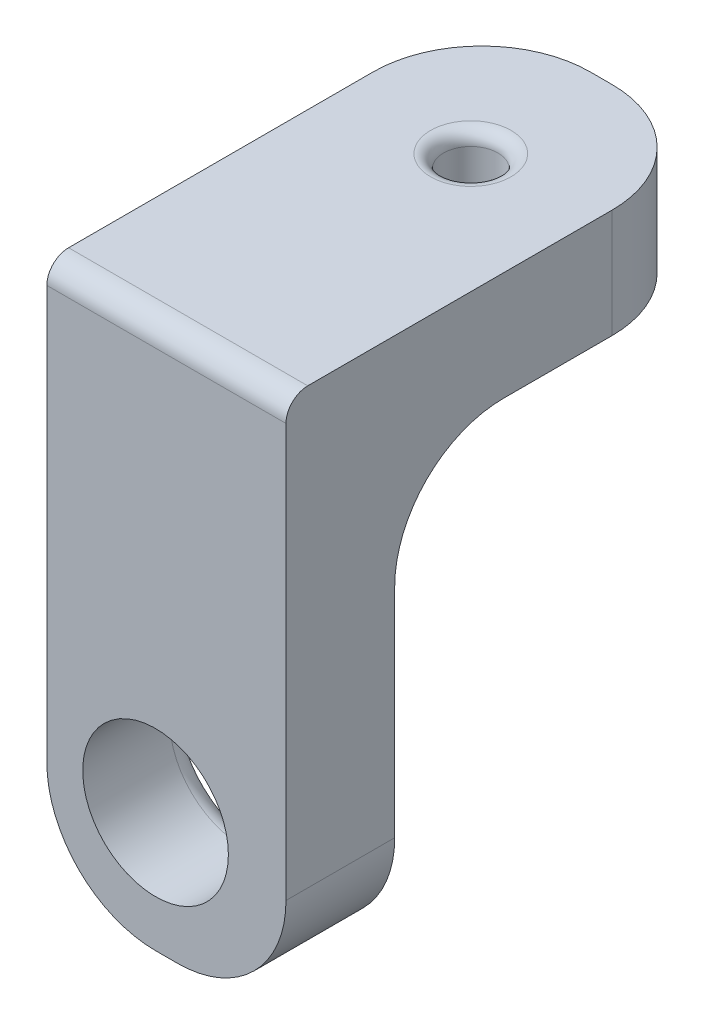
ISO-10303-21;
HEADER;
FILE_DESCRIPTION(('STEP AP214'),'2;1');
FILE_NAME('part.step','',(''),(''),'','','');
FILE_SCHEMA(('AUTOMOTIVE_DESIGN { 1 0 10303 214 1 1 1 1 }'));
ENDSEC;
DATA;
#1=APPLICATION_CONTEXT('core data for automotive mechanical design processes');
#2=APPLICATION_PROTOCOL_DEFINITION('international standard','automotive_design',2000,#1);
#3=PRODUCT_CONTEXT('',#1,'mechanical');
#4=PRODUCT('Part','Part','',(#3));
#5=PRODUCT_RELATED_PRODUCT_CATEGORY('part','',(#4));
#6=PRODUCT_DEFINITION_FORMATION('','',#4);
#7=PRODUCT_DEFINITION_CONTEXT('part definition',#1,'design');
#8=PRODUCT_DEFINITION('design','',#6,#7);
#9=PRODUCT_DEFINITION_SHAPE('','',#8);
#10=(LENGTH_UNIT() NAMED_UNIT(*) SI_UNIT(.MILLI.,.METRE.));
#11=(NAMED_UNIT(*) PLANE_ANGLE_UNIT() SI_UNIT($,.RADIAN.));
#12=(NAMED_UNIT(*) SI_UNIT($,.STERADIAN.) SOLID_ANGLE_UNIT());
#13=UNCERTAINTY_MEASURE_WITH_UNIT(LENGTH_MEASURE(1.E-05),#10,'distance_accuracy_value','');
#14=(GEOMETRIC_REPRESENTATION_CONTEXT(3) GLOBAL_UNCERTAINTY_ASSIGNED_CONTEXT((#13)) GLOBAL_UNIT_ASSIGNED_CONTEXT((#10,
#11,#12)) REPRESENTATION_CONTEXT('',''));
#15=CARTESIAN_POINT('',(0.,0.,0.));
#16=DIRECTION('',(0.,0.,1.));
#17=DIRECTION('',(1.,0.,0.));
#18=AXIS2_PLACEMENT_3D('',#15,#16,#17);
#19=CARTESIAN_POINT('',(0.,0.,5.));
#20=DIRECTION('',(0.,0.,1.));
#21=DIRECTION('',(1.,0.,0.));
#22=AXIS2_PLACEMENT_3D('',#19,#20,#21);
#23=PLANE('',#22);
#24=DIRECTION('',(1.,0.,0.));
#25=VECTOR('',#24,1.);
#26=CARTESIAN_POINT('',(-5.,-5.5,5.));
#27=LINE('',#26,#25);
#28=CARTESIAN_POINT('',(0.,-5.5,5.));
#29=VERTEX_POINT('',#28);
#30=CARTESIAN_POINT('',(0.999999999999999,-5.5,5.));
#31=VERTEX_POINT('',#30);
#32=EDGE_CURVE('E272',#29,#31,#27,.T.);
#33=ORIENTED_EDGE('',*,*,#32,.T.);
#34=CARTESIAN_POINT('',(0.999999999999999,-0.5,5.));
#35=DIRECTION('',(0.,0.,1.));
#36=DIRECTION('',(1.,0.,0.));
#37=AXIS2_PLACEMENT_3D('',#34,#35,#36);
#38=CIRCLE('',#37,5.);
#39=CARTESIAN_POINT('',(6.,-0.5,5.));
#40=VERTEX_POINT('',#39);
#41=EDGE_CURVE('E346',#31,#40,#38,.T.);
#42=ORIENTED_EDGE('',*,*,#41,.T.);
#43=DIRECTION('',(0.,1.,0.));
#44=VECTOR('',#43,1.);
#45=CARTESIAN_POINT('',(6.,14.5,5.));
#46=LINE('',#45,#44);
#47=CARTESIAN_POINT('',(6.,18.5,5.));
#48=VERTEX_POINT('',#47);
#49=EDGE_CURVE('E277',#40,#48,#46,.T.);
#50=ORIENTED_EDGE('',*,*,#49,.T.);
#51=DIRECTION('',(1.,0.,0.));
#52=VECTOR('',#51,1.);
#53=CARTESIAN_POINT('',(-5.,18.5,5.));
#54=LINE('',#53,#52);
#55=CARTESIAN_POINT('',(-5.,18.5,5.));
#56=VERTEX_POINT('',#55);
#57=EDGE_CURVE('E319',#48,#56,#54,.F.);
#58=ORIENTED_EDGE('',*,*,#57,.T.);
#59=DIRECTION('',(0.,-1.,0.));
#60=VECTOR('',#59,1.);
#61=CARTESIAN_POINT('',(-5.,14.5,5.));
#62=LINE('',#61,#60);
#63=CARTESIAN_POINT('',(-5.,-0.5,5.));
#64=VERTEX_POINT('',#63);
#65=EDGE_CURVE('E268',#56,#64,#62,.T.);
#66=ORIENTED_EDGE('',*,*,#65,.T.);
#67=CARTESIAN_POINT('',(0.,-0.5,5.));
#68=DIRECTION('',(0.,0.,1.));
#69=DIRECTION('',(1.,0.,0.));
#70=AXIS2_PLACEMENT_3D('',#67,#68,#69);
#71=CIRCLE('',#70,5.);
#72=EDGE_CURVE('E343',#64,#29,#71,.T.);
#73=ORIENTED_EDGE('',*,*,#72,.T.);
#74=EDGE_LOOP('',(#33,#42,#50,#58,#66,#73));
#75=FACE_BOUND('',#74,.T.);
#76=CARTESIAN_POINT('',(0.,0.,5.));
#77=DIRECTION('',(0.,0.,1.));
#78=DIRECTION('',(1.,0.,0.));
#79=AXIS2_PLACEMENT_3D('',#76,#77,#78);
#80=CIRCLE('',#79,3.35);
#81=CARTESIAN_POINT('',(3.35,0.,5.));
#82=VERTEX_POINT('',#81);
#83=EDGE_CURVE('E255',#82,#82,#80,.T.);
#84=ORIENTED_EDGE('',*,*,#83,.F.);
#85=EDGE_LOOP('',(#84));
#86=FACE_BOUND('',#85,.T.);
#87=ADVANCED_FACE('F41',(#75,#86),#23,.T.);
#88=CARTESIAN_POINT('',(0.,0.,0.));
#89=DIRECTION('',(0.,0.,1.));
#90=DIRECTION('',(1.,0.,0.));
#91=AXIS2_PLACEMENT_3D('',#88,#89,#90);
#92=PLANE('',#91);
#93=CARTESIAN_POINT('',(0.,0.,0.));
#94=DIRECTION('',(0.,0.,1.));
#95=DIRECTION('',(1.,0.,0.));
#96=AXIS2_PLACEMENT_3D('',#93,#94,#95);
#97=CIRCLE('',#96,4.35);
#98=CARTESIAN_POINT('',(4.35,0.,0.));
#99=VERTEX_POINT('',#98);
#100=EDGE_CURVE('E303',#99,#99,#97,.T.);
#101=ORIENTED_EDGE('',*,*,#100,.T.);
#102=EDGE_LOOP('',(#101));
#103=FACE_BOUND('',#102,.T.);
#104=DIRECTION('',(0.,1.,0.));
#105=VECTOR('',#104,1.);
#106=CARTESIAN_POINT('',(6.,14.5,0.));
#107=LINE('',#106,#105);
#108=CARTESIAN_POINT('',(6.,-0.5,0.));
#109=VERTEX_POINT('',#108);
#110=CARTESIAN_POINT('',(6.,9.5,0.));
#111=VERTEX_POINT('',#110);
#112=EDGE_CURVE('E273',#109,#111,#107,.T.);
#113=ORIENTED_EDGE('',*,*,#112,.F.);
#114=CARTESIAN_POINT('',(0.999999999999999,-0.5,0.));
#115=DIRECTION('',(0.,0.,1.));
#116=DIRECTION('',(1.,0.,0.));
#117=AXIS2_PLACEMENT_3D('',#114,#115,#116);
#118=CIRCLE('',#117,5.);
#119=CARTESIAN_POINT('',(0.999999999999999,-5.5,0.));
#120=VERTEX_POINT('',#119);
#121=EDGE_CURVE('E333',#109,#120,#118,.F.);
#122=ORIENTED_EDGE('',*,*,#121,.T.);
#123=DIRECTION('',(1.,0.,0.));
#124=VECTOR('',#123,1.);
#125=CARTESIAN_POINT('',(-5.,-5.5,0.));
#126=LINE('',#125,#124);
#127=CARTESIAN_POINT('',(0.,-5.5,0.));
#128=VERTEX_POINT('',#127);
#129=EDGE_CURVE('E284',#128,#120,#126,.T.);
#130=ORIENTED_EDGE('',*,*,#129,.F.);
#131=CARTESIAN_POINT('',(0.,-0.5,0.));
#132=DIRECTION('',(0.,0.,1.));
#133=DIRECTION('',(1.,0.,0.));
#134=AXIS2_PLACEMENT_3D('',#131,#132,#133);
#135=CIRCLE('',#134,5.);
#136=CARTESIAN_POINT('',(-5.,-0.5,0.));
#137=VERTEX_POINT('',#136);
#138=EDGE_CURVE('E330',#128,#137,#135,.F.);
#139=ORIENTED_EDGE('',*,*,#138,.T.);
#140=DIRECTION('',(0.,-1.,0.));
#141=VECTOR('',#140,1.);
#142=CARTESIAN_POINT('',(-5.,14.5,0.));
#143=LINE('',#142,#141);
#144=CARTESIAN_POINT('',(-5.,9.5,0.));
#145=VERTEX_POINT('',#144);
#146=EDGE_CURVE('E267',#145,#137,#143,.T.);
#147=ORIENTED_EDGE('',*,*,#146,.F.);
#148=DIRECTION('',(-1.,0.,0.));
#149=VECTOR('',#148,1.);
#150=CARTESIAN_POINT('',(0.,9.5,0.));
#151=LINE('',#150,#149);
#152=EDGE_CURVE('E293',#145,#111,#151,.F.);
#153=ORIENTED_EDGE('',*,*,#152,.T.);
#154=EDGE_LOOP('',(#113,#122,#130,#139,#147,#153));
#155=FACE_BOUND('',#154,.T.);
#156=ADVANCED_FACE('F393',(#103,#155),#92,.F.);
#157=CARTESIAN_POINT('',(-5.,14.5,5.));
#158=DIRECTION('',(1.,0.,0.));
#159=DIRECTION('',(0.,1.,0.));
#160=AXIS2_PLACEMENT_3D('',#157,#158,#159);
#161=PLANE('',#160);
#162=DIRECTION('',(0.,0.,1.));
#163=VECTOR('',#162,1.);
#164=CARTESIAN_POINT('',(-5.,19.5,5.));
#165=LINE('',#164,#163);
#166=CARTESIAN_POINT('',(-5.,19.5,-10.));
#167=VERTEX_POINT('',#166);
#168=CARTESIAN_POINT('',(-5.,19.5,4.));
#169=VERTEX_POINT('',#168);
#170=EDGE_CURVE('E244',#167,#169,#165,.T.);
#171=ORIENTED_EDGE('',*,*,#170,.F.);
#172=DIRECTION('',(0.,-1.,0.));
#173=VECTOR('',#172,1.);
#174=CARTESIAN_POINT('',(-5.,14.5,-10.));
#175=LINE('',#174,#173);
#176=CARTESIAN_POINT('',(-5.,14.5,-10.));
#177=VERTEX_POINT('',#176);
#178=EDGE_CURVE('E352',#167,#177,#175,.T.);
#179=ORIENTED_EDGE('',*,*,#178,.T.);
#180=DIRECTION('',(0.,0.,1.));
#181=VECTOR('',#180,1.);
#182=CARTESIAN_POINT('',(-5.,14.5,5.));
#183=LINE('',#182,#181);
#184=CARTESIAN_POINT('',(-5.,14.5,-5.));
#185=VERTEX_POINT('',#184);
#186=EDGE_CURVE('E232',#177,#185,#183,.T.);
#187=ORIENTED_EDGE('',*,*,#186,.T.);
#188=CARTESIAN_POINT('',(-5.,9.5,-5.));
#189=DIRECTION('',(1.,0.,0.));
#190=DIRECTION('',(0.,1.,0.));
#191=AXIS2_PLACEMENT_3D('',#188,#189,#190);
#192=CIRCLE('',#191,5.);
#193=EDGE_CURVE('E297',#185,#145,#192,.T.);
#194=ORIENTED_EDGE('',*,*,#193,.T.);
#195=ORIENTED_EDGE('',*,*,#146,.T.);
#196=DIRECTION('',(0.,0.,-1.));
#197=VECTOR('',#196,1.);
#198=CARTESIAN_POINT('',(-5.,-0.5,5.));
#199=LINE('',#198,#197);
#200=EDGE_CURVE('E349',#137,#64,#199,.F.);
#201=ORIENTED_EDGE('',*,*,#200,.T.);
#202=ORIENTED_EDGE('',*,*,#65,.F.);
#203=CARTESIAN_POINT('',(-5.,18.5,4.));
#204=DIRECTION('',(1.,0.,0.));
#205=DIRECTION('',(0.,1.,0.));
#206=AXIS2_PLACEMENT_3D('',#203,#204,#205);
#207=CIRCLE('',#206,1.);
#208=EDGE_CURVE('E322',#56,#169,#207,.F.);
#209=ORIENTED_EDGE('',*,*,#208,.T.);
#210=EDGE_LOOP('',(#171,#179,#187,#194,#195,#201,#202,#209));
#211=FACE_BOUND('',#210,.T.);
#212=ADVANCED_FACE('F399',(#211),#161,.F.);
#213=CARTESIAN_POINT('',(-5.,-5.5,5.));
#214=DIRECTION('',(0.,1.,0.));
#215=DIRECTION('',(0.,0.,1.));
#216=AXIS2_PLACEMENT_3D('',#213,#214,#215);
#217=PLANE('',#216);
#218=ORIENTED_EDGE('',*,*,#129,.T.);
#219=DIRECTION('',(0.,0.,-1.));
#220=VECTOR('',#219,1.);
#221=CARTESIAN_POINT('',(0.999999999999999,-5.5,5.));
#222=LINE('',#221,#220);
#223=EDGE_CURVE('E340',#120,#31,#222,.F.);
#224=ORIENTED_EDGE('',*,*,#223,.T.);
#225=ORIENTED_EDGE('',*,*,#32,.F.);
#226=DIRECTION('',(0.,0.,-1.));
#227=VECTOR('',#226,1.);
#228=CARTESIAN_POINT('',(0.,-5.5,5.));
#229=LINE('',#228,#227);
#230=EDGE_CURVE('E336',#29,#128,#229,.T.);
#231=ORIENTED_EDGE('',*,*,#230,.T.);
#232=EDGE_LOOP('',(#218,#224,#225,#231));
#233=FACE_BOUND('',#232,.T.);
#234=ADVANCED_FACE('F410',(#233),#217,.F.);
#235=CARTESIAN_POINT('',(6.,14.5,5.));
#236=DIRECTION('',(-1.,0.,0.));
#237=DIRECTION('',(0.,-1.,0.));
#238=AXIS2_PLACEMENT_3D('',#235,#236,#237);
#239=PLANE('',#238);
#240=DIRECTION('',(0.,0.,-1.));
#241=VECTOR('',#240,1.);
#242=CARTESIAN_POINT('',(6.,14.5,5.));
#243=LINE('',#242,#241);
#244=CARTESIAN_POINT('',(6.,14.5,-5.));
#245=VERTEX_POINT('',#244);
#246=CARTESIAN_POINT('',(6.,14.5,-10.));
#247=VERTEX_POINT('',#246);
#248=EDGE_CURVE('E258',#245,#247,#243,.T.);
#249=ORIENTED_EDGE('',*,*,#248,.T.);
#250=DIRECTION('',(0.,-1.,0.));
#251=VECTOR('',#250,1.);
#252=CARTESIAN_POINT('',(6.,14.5,-10.));
#253=LINE('',#252,#251);
#254=CARTESIAN_POINT('',(6.,19.5,-10.));
#255=VERTEX_POINT('',#254);
#256=EDGE_CURVE('E65',#247,#255,#253,.F.);
#257=ORIENTED_EDGE('',*,*,#256,.T.);
#258=DIRECTION('',(0.,0.,-1.));
#259=VECTOR('',#258,1.);
#260=CARTESIAN_POINT('',(6.,19.5,5.));
#261=LINE('',#260,#259);
#262=CARTESIAN_POINT('',(6.,19.5,4.));
#263=VERTEX_POINT('',#262);
#264=EDGE_CURVE('E247',#263,#255,#261,.T.);
#265=ORIENTED_EDGE('',*,*,#264,.F.);
#266=CARTESIAN_POINT('',(6.,18.5,4.));
#267=DIRECTION('',(-1.,0.,0.));
#268=DIRECTION('',(0.,-1.,0.));
#269=AXIS2_PLACEMENT_3D('',#266,#267,#268);
#270=CIRCLE('',#269,1.);
#271=EDGE_CURVE('E315',#263,#48,#270,.F.);
#272=ORIENTED_EDGE('',*,*,#271,.T.);
#273=ORIENTED_EDGE('',*,*,#49,.F.);
#274=DIRECTION('',(0.,0.,-1.));
#275=VECTOR('',#274,1.);
#276=CARTESIAN_POINT('',(6.,-0.5,5.));
#277=LINE('',#276,#275);
#278=EDGE_CURVE('E326',#40,#109,#277,.T.);
#279=ORIENTED_EDGE('',*,*,#278,.T.);
#280=ORIENTED_EDGE('',*,*,#112,.T.);
#281=CARTESIAN_POINT('',(6.,9.5,-5.));
#282=DIRECTION('',(-1.,0.,0.));
#283=DIRECTION('',(0.,-1.,0.));
#284=AXIS2_PLACEMENT_3D('',#281,#282,#283);
#285=CIRCLE('',#284,5.);
#286=EDGE_CURVE('E300',#111,#245,#285,.T.);
#287=ORIENTED_EDGE('',*,*,#286,.T.);
#288=EDGE_LOOP('',(#249,#257,#265,#272,#273,#279,#280,#287));
#289=FACE_BOUND('',#288,.T.);
#290=ADVANCED_FACE('F407',(#289),#239,.F.);
#291=CARTESIAN_POINT('',(0.,0.,5.));
#292=DIRECTION('',(0.,0.,-1.));
#293=DIRECTION('',(-1.,0.,0.));
#294=AXIS2_PLACEMENT_3D('',#291,#292,#293);
#295=CYLINDRICAL_SURFACE('',#294,3.35);
#296=CARTESIAN_POINT('',(0.,0.,1.));
#297=DIRECTION('',(0.,0.,1.));
#298=DIRECTION('',(1.,0.,0.));
#299=AXIS2_PLACEMENT_3D('',#296,#297,#298);
#300=CIRCLE('',#299,3.35);
#301=CARTESIAN_POINT('',(3.35,0.,1.));
#302=VERTEX_POINT('',#301);
#303=EDGE_CURVE('E307',#302,#302,#300,.F.);
#304=ORIENTED_EDGE('',*,*,#303,.T.);
#305=EDGE_LOOP('',(#304));
#306=FACE_BOUND('',#305,.T.);
#307=ORIENTED_EDGE('',*,*,#83,.T.);
#308=EDGE_LOOP('',(#307));
#309=FACE_BOUND('',#308,.T.);
#310=ADVANCED_FACE('F404',(#306,#309),#295,.F.);
#311=CARTESIAN_POINT('',(-5.,19.5,-15.));
#312=DIRECTION('',(0.,0.,1.));
#313=DIRECTION('',(1.,0.,0.));
#314=AXIS2_PLACEMENT_3D('',#311,#312,#313);
#315=PLANE('',#314);
#316=DIRECTION('',(-1.,0.,0.));
#317=VECTOR('',#316,1.);
#318=CARTESIAN_POINT('',(-5.,14.5,-15.));
#319=LINE('',#318,#317);
#320=CARTESIAN_POINT('',(0.999999999999997,14.5,-15.));
#321=VERTEX_POINT('',#320);
#322=CARTESIAN_POINT('',(0.,14.5,-15.));
#323=VERTEX_POINT('',#322);
#324=EDGE_CURVE('E248',#321,#323,#319,.T.);
#325=ORIENTED_EDGE('',*,*,#324,.T.);
#326=DIRECTION('',(0.,-1.,0.));
#327=VECTOR('',#326,1.);
#328=CARTESIAN_POINT('',(0.,19.5,-15.));
#329=LINE('',#328,#327);
#330=CARTESIAN_POINT('',(0.,19.5,-15.));
#331=VERTEX_POINT('',#330);
#332=EDGE_CURVE('E366',#323,#331,#329,.F.);
#333=ORIENTED_EDGE('',*,*,#332,.T.);
#334=DIRECTION('',(-1.,0.,0.));
#335=VECTOR('',#334,1.);
#336=CARTESIAN_POINT('',(-5.,19.5,-15.));
#337=LINE('',#336,#335);
#338=CARTESIAN_POINT('',(0.999999999999997,19.5,-15.));
#339=VERTEX_POINT('',#338);
#340=EDGE_CURVE('E251',#339,#331,#337,.T.);
#341=ORIENTED_EDGE('',*,*,#340,.F.);
#342=DIRECTION('',(0.,-1.,0.));
#343=VECTOR('',#342,1.);
#344=CARTESIAN_POINT('',(0.999999999999997,19.5,-15.));
#345=LINE('',#344,#343);
#346=EDGE_CURVE('E362',#339,#321,#345,.T.);
#347=ORIENTED_EDGE('',*,*,#346,.T.);
#348=EDGE_LOOP('',(#325,#333,#341,#347));
#349=FACE_BOUND('',#348,.T.);
#350=ADVANCED_FACE('F454',(#349),#315,.F.);
#351=CARTESIAN_POINT('',(0.,19.5,0.));
#352=DIRECTION('',(0.,-1.,0.));
#353=DIRECTION('',(0.,0.,-1.));
#354=AXIS2_PLACEMENT_3D('',#351,#352,#353);
#355=PLANE('',#354);
#356=CARTESIAN_POINT('',(0.499999999999999,19.5,-9.));
#357=DIRECTION('',(0.,-1.,0.));
#358=DIRECTION('',(0.,0.,-1.));
#359=AXIS2_PLACEMENT_3D('',#356,#357,#358);
#360=CIRCLE('',#359,1.85);
#361=CARTESIAN_POINT('',(0.499999999999999,19.5,-10.85));
#362=VERTEX_POINT('',#361);
#363=EDGE_CURVE('E50',#362,#362,#360,.T.);
#364=ORIENTED_EDGE('',*,*,#363,.T.);
#365=EDGE_LOOP('',(#364));
#366=FACE_BOUND('',#365,.T.);
#367=ORIENTED_EDGE('',*,*,#340,.T.);
#368=CARTESIAN_POINT('',(0.,19.5,-10.));
#369=DIRECTION('',(0.,-1.,0.));
#370=DIRECTION('',(0.,0.,-1.));
#371=AXIS2_PLACEMENT_3D('',#368,#369,#370);
#372=CIRCLE('',#371,5.);
#373=EDGE_CURVE('E372',#331,#167,#372,.F.);
#374=ORIENTED_EDGE('',*,*,#373,.T.);
#375=ORIENTED_EDGE('',*,*,#170,.T.);
#376=DIRECTION('',(1.,0.,0.));
#377=VECTOR('',#376,1.);
#378=CARTESIAN_POINT('',(6.,19.5,4.));
#379=LINE('',#378,#377);
#380=EDGE_CURVE('E311',#169,#263,#379,.T.);
#381=ORIENTED_EDGE('',*,*,#380,.T.);
#382=ORIENTED_EDGE('',*,*,#264,.T.);
#383=CARTESIAN_POINT('',(0.999999999999997,19.5,-10.));
#384=DIRECTION('',(0.,-1.,0.));
#385=DIRECTION('',(0.,0.,-1.));
#386=AXIS2_PLACEMENT_3D('',#383,#384,#385);
#387=CIRCLE('',#386,5.);
#388=EDGE_CURVE('E369',#255,#339,#387,.F.);
#389=ORIENTED_EDGE('',*,*,#388,.T.);
#390=EDGE_LOOP('',(#367,#374,#375,#381,#382,#389));
#391=FACE_BOUND('',#390,.T.);
#392=ADVANCED_FACE('F380',(#366,#391),#355,.F.);
#393=CARTESIAN_POINT('',(0.,14.5,0.));
#394=DIRECTION('',(0.,-1.,0.));
#395=DIRECTION('',(0.,0.,-1.));
#396=AXIS2_PLACEMENT_3D('',#393,#394,#395);
#397=PLANE('',#396);
#398=DIRECTION('',(0.5,0.,0.866025403784439));
#399=VECTOR('',#398,1.);
#400=CARTESIAN_POINT('',(1.65470053837925,14.5,-11.));
#401=LINE('',#400,#399);
#402=CARTESIAN_POINT('',(1.65470053837925,14.5,-11.));
#403=VERTEX_POINT('',#402);
#404=CARTESIAN_POINT('',(2.8094010767585,14.5,-9.));
#405=VERTEX_POINT('',#404);
#406=EDGE_CURVE('E57',#403,#405,#401,.T.);
#407=ORIENTED_EDGE('',*,*,#406,.F.);
#408=DIRECTION('',(1.,0.,0.));
#409=VECTOR('',#408,1.);
#410=CARTESIAN_POINT('',(-0.654700538379259,14.5,-11.));
#411=LINE('',#410,#409);
#412=CARTESIAN_POINT('',(-0.654700538379259,14.5,-11.));
#413=VERTEX_POINT('',#412);
#414=EDGE_CURVE('E193',#413,#403,#411,.T.);
#415=ORIENTED_EDGE('',*,*,#414,.F.);
#416=DIRECTION('',(0.5,0.,-0.866025403784438));
#417=VECTOR('',#416,1.);
#418=CARTESIAN_POINT('',(-1.8094010767585,14.5,-9.00000000000001));
#419=LINE('',#418,#417);
#420=CARTESIAN_POINT('',(-1.8094010767585,14.5,-9.00000000000001));
#421=VERTEX_POINT('',#420);
#422=EDGE_CURVE('E197',#421,#413,#419,.T.);
#423=ORIENTED_EDGE('',*,*,#422,.F.);
#424=DIRECTION('',(-0.5,0.,-0.866025403784439));
#425=VECTOR('',#424,1.);
#426=CARTESIAN_POINT('',(-0.654700538379243,14.5,-7.));
#427=LINE('',#426,#425);
#428=CARTESIAN_POINT('',(-0.654700538379243,14.5,-7.));
#429=VERTEX_POINT('',#428);
#430=EDGE_CURVE('E222',#429,#421,#427,.T.);
#431=ORIENTED_EDGE('',*,*,#430,.F.);
#432=DIRECTION('',(-1.,0.,0.));
#433=VECTOR('',#432,1.);
#434=CARTESIAN_POINT('',(1.65470053837925,14.5,-7.));
#435=LINE('',#434,#433);
#436=CARTESIAN_POINT('',(1.65470053837925,14.5,-7.));
#437=VERTEX_POINT('',#436);
#438=EDGE_CURVE('E218',#437,#429,#435,.T.);
#439=ORIENTED_EDGE('',*,*,#438,.F.);
#440=DIRECTION('',(-0.5,0.,0.866025403784439));
#441=VECTOR('',#440,1.);
#442=CARTESIAN_POINT('',(2.8094010767585,14.5,-9.));
#443=LINE('',#442,#441);
#444=EDGE_CURVE('E215',#405,#437,#443,.T.);
#445=ORIENTED_EDGE('',*,*,#444,.F.);
#446=EDGE_LOOP('',(#407,#415,#423,#431,#439,#445));
#447=FACE_BOUND('',#446,.T.);
#448=ORIENTED_EDGE('',*,*,#186,.F.);
#449=CARTESIAN_POINT('',(0.,14.5,-10.));
#450=DIRECTION('',(0.,-1.,0.));
#451=DIRECTION('',(0.,0.,-1.));
#452=AXIS2_PLACEMENT_3D('',#449,#450,#451);
#453=CIRCLE('',#452,5.);
#454=EDGE_CURVE('E359',#177,#323,#453,.T.);
#455=ORIENTED_EDGE('',*,*,#454,.T.);
#456=ORIENTED_EDGE('',*,*,#324,.F.);
#457=CARTESIAN_POINT('',(0.999999999999997,14.5,-10.));
#458=DIRECTION('',(0.,-1.,0.));
#459=DIRECTION('',(0.,0.,-1.));
#460=AXIS2_PLACEMENT_3D('',#457,#458,#459);
#461=CIRCLE('',#460,5.);
#462=EDGE_CURVE('E356',#321,#247,#461,.T.);
#463=ORIENTED_EDGE('',*,*,#462,.T.);
#464=ORIENTED_EDGE('',*,*,#248,.F.);
#465=DIRECTION('',(-1.,0.,0.));
#466=VECTOR('',#465,1.);
#467=CARTESIAN_POINT('',(0.,14.5,-5.));
#468=LINE('',#467,#466);
#469=EDGE_CURVE('E280',#245,#185,#468,.T.);
#470=ORIENTED_EDGE('',*,*,#469,.T.);
#471=EDGE_LOOP('',(#448,#455,#456,#463,#464,#470));
#472=FACE_BOUND('',#471,.T.);
#473=ADVANCED_FACE('F421',(#447,#472),#397,.T.);
#474=CARTESIAN_POINT('',(0.,9.5,-5.));
#475=DIRECTION('',(-1.,0.,0.));
#476=DIRECTION('',(0.,0.,1.));
#477=AXIS2_PLACEMENT_3D('',#474,#475,#476);
#478=CYLINDRICAL_SURFACE('',#477,5.);
#479=ORIENTED_EDGE('',*,*,#286,.F.);
#480=ORIENTED_EDGE('',*,*,#152,.F.);
#481=ORIENTED_EDGE('',*,*,#193,.F.);
#482=ORIENTED_EDGE('',*,*,#469,.F.);
#483=EDGE_LOOP('',(#479,#480,#481,#482));
#484=FACE_BOUND('',#483,.T.);
#485=ADVANCED_FACE('F417',(#484),#478,.F.);
#486=CARTESIAN_POINT('',(0.,0.,1.));
#487=DIRECTION('',(0.,0.,1.));
#488=DIRECTION('',(1.,0.,0.));
#489=AXIS2_PLACEMENT_3D('',#486,#487,#488);
#490=TOROIDAL_SURFACE('',#489,4.35,1.);
#491=ORIENTED_EDGE('',*,*,#303,.F.);
#492=EDGE_LOOP('',(#491));
#493=FACE_BOUND('',#492,.T.);
#494=ORIENTED_EDGE('',*,*,#100,.F.);
#495=EDGE_LOOP('',(#494));
#496=FACE_BOUND('',#495,.T.);
#497=ADVANCED_FACE('F420',(#493,#496),#490,.T.);
#498=CARTESIAN_POINT('',(0.,18.5,4.));
#499=DIRECTION('',(-1.,0.,0.));
#500=DIRECTION('',(0.,0.,1.));
#501=AXIS2_PLACEMENT_3D('',#498,#499,#500);
#502=CYLINDRICAL_SURFACE('',#501,1.);
#503=ORIENTED_EDGE('',*,*,#208,.F.);
#504=ORIENTED_EDGE('',*,*,#57,.F.);
#505=ORIENTED_EDGE('',*,*,#271,.F.);
#506=ORIENTED_EDGE('',*,*,#380,.F.);
#507=EDGE_LOOP('',(#503,#504,#505,#506));
#508=FACE_BOUND('',#507,.T.);
#509=ADVANCED_FACE('F425',(#508),#502,.T.);
#510=CARTESIAN_POINT('',(0.999999999999999,-0.5,5.));
#511=DIRECTION('',(0.,0.,-1.));
#512=DIRECTION('',(-1.,0.,0.));
#513=AXIS2_PLACEMENT_3D('',#510,#511,#512);
#514=CYLINDRICAL_SURFACE('',#513,5.);
#515=ORIENTED_EDGE('',*,*,#41,.F.);
#516=ORIENTED_EDGE('',*,*,#223,.F.);
#517=ORIENTED_EDGE('',*,*,#121,.F.);
#518=ORIENTED_EDGE('',*,*,#278,.F.);
#519=EDGE_LOOP('',(#515,#516,#517,#518));
#520=FACE_BOUND('',#519,.T.);
#521=ADVANCED_FACE('F429',(#520),#514,.T.);
#522=CARTESIAN_POINT('',(0.,-0.5,5.));
#523=DIRECTION('',(0.,0.,-1.));
#524=DIRECTION('',(-1.,0.,0.));
#525=AXIS2_PLACEMENT_3D('',#522,#523,#524);
#526=CYLINDRICAL_SURFACE('',#525,5.);
#527=ORIENTED_EDGE('',*,*,#72,.F.);
#528=ORIENTED_EDGE('',*,*,#200,.F.);
#529=ORIENTED_EDGE('',*,*,#138,.F.);
#530=ORIENTED_EDGE('',*,*,#230,.F.);
#531=EDGE_LOOP('',(#527,#528,#529,#530));
#532=FACE_BOUND('',#531,.T.);
#533=ADVANCED_FACE('F433',(#532),#526,.T.);
#534=CARTESIAN_POINT('',(0.,14.5,-10.));
#535=DIRECTION('',(0.,-1.,0.));
#536=DIRECTION('',(1.,0.,0.));
#537=AXIS2_PLACEMENT_3D('',#534,#535,#536);
#538=CYLINDRICAL_SURFACE('',#537,5.);
#539=ORIENTED_EDGE('',*,*,#373,.F.);
#540=ORIENTED_EDGE('',*,*,#332,.F.);
#541=ORIENTED_EDGE('',*,*,#454,.F.);
#542=ORIENTED_EDGE('',*,*,#178,.F.);
#543=EDGE_LOOP('',(#539,#540,#541,#542));
#544=FACE_BOUND('',#543,.T.);
#545=ADVANCED_FACE('F437',(#544),#538,.T.);
#546=CARTESIAN_POINT('',(0.999999999999997,19.5,-10.));
#547=DIRECTION('',(0.,-1.,0.));
#548=DIRECTION('',(1.,0.,0.));
#549=AXIS2_PLACEMENT_3D('',#546,#547,#548);
#550=CYLINDRICAL_SURFACE('',#549,5.);
#551=ORIENTED_EDGE('',*,*,#388,.F.);
#552=ORIENTED_EDGE('',*,*,#256,.F.);
#553=ORIENTED_EDGE('',*,*,#462,.F.);
#554=ORIENTED_EDGE('',*,*,#346,.F.);
#555=EDGE_LOOP('',(#551,#552,#553,#554));
#556=FACE_BOUND('',#555,.T.);
#557=ADVANCED_FACE('F440',(#556),#550,.T.);
#558=CARTESIAN_POINT('',(1.65470053837925,16.5,-11.));
#559=DIRECTION('',(0.866025403784439,0.,-0.5));
#560=DIRECTION('',(-0.5,0.,-0.866025403784439));
#561=AXIS2_PLACEMENT_3D('',#558,#559,#560);
#562=PLANE('',#561);
#563=ORIENTED_EDGE('',*,*,#406,.T.);
#564=DIRECTION('',(0.,-1.,0.));
#565=VECTOR('',#564,1.);
#566=CARTESIAN_POINT('',(2.8094010767585,16.5,-9.));
#567=LINE('',#566,#565);
#568=CARTESIAN_POINT('',(2.8094010767585,16.5,-9.));
#569=VERTEX_POINT('',#568);
#570=EDGE_CURVE('E167',#569,#405,#567,.T.);
#571=ORIENTED_EDGE('',*,*,#570,.F.);
#572=DIRECTION('',(0.5,0.,0.866025403784439));
#573=VECTOR('',#572,1.);
#574=CARTESIAN_POINT('',(1.65470053837925,16.5,-11.));
#575=LINE('',#574,#573);
#576=CARTESIAN_POINT('',(1.65470053837925,16.5,-11.));
#577=VERTEX_POINT('',#576);
#578=EDGE_CURVE('E171',#577,#569,#575,.T.);
#579=ORIENTED_EDGE('',*,*,#578,.F.);
#580=DIRECTION('',(0.,-1.,0.));
#581=VECTOR('',#580,1.);
#582=CARTESIAN_POINT('',(1.65470053837925,16.5,-11.));
#583=LINE('',#582,#581);
#584=EDGE_CURVE('E229',#577,#403,#583,.T.);
#585=ORIENTED_EDGE('',*,*,#584,.T.);
#586=EDGE_LOOP('',(#563,#571,#579,#585));
#587=FACE_BOUND('',#586,.T.);
#588=ADVANCED_FACE('F169',(#587),#562,.F.);
#589=CARTESIAN_POINT('',(-0.654700538379259,16.5,-11.));
#590=DIRECTION('',(0.,0.,-1.));
#591=DIRECTION('',(-1.,0.,0.));
#592=AXIS2_PLACEMENT_3D('',#589,#590,#591);
#593=PLANE('',#592);
#594=ORIENTED_EDGE('',*,*,#414,.T.);
#595=ORIENTED_EDGE('',*,*,#584,.F.);
#596=DIRECTION('',(1.,0.,0.));
#597=VECTOR('',#596,1.);
#598=CARTESIAN_POINT('',(-0.654700538379259,16.5,-11.));
#599=LINE('',#598,#597);
#600=CARTESIAN_POINT('',(-0.654700538379259,16.5,-11.));
#601=VERTEX_POINT('',#600);
#602=EDGE_CURVE('E178',#601,#577,#599,.T.);
#603=ORIENTED_EDGE('',*,*,#602,.F.);
#604=DIRECTION('',(0.,-1.,0.));
#605=VECTOR('',#604,1.);
#606=CARTESIAN_POINT('',(-0.654700538379259,16.5,-11.));
#607=LINE('',#606,#605);
#608=EDGE_CURVE('E233',#601,#413,#607,.T.);
#609=ORIENTED_EDGE('',*,*,#608,.T.);
#610=EDGE_LOOP('',(#594,#595,#603,#609));
#611=FACE_BOUND('',#610,.T.);
#612=ADVANCED_FACE('F447',(#611),#593,.F.);
#613=CARTESIAN_POINT('',(-1.8094010767585,16.5,-9.00000000000001));
#614=DIRECTION('',(-0.866025403784439,0.,-0.5));
#615=DIRECTION('',(-0.5,0.,0.866025403784438));
#616=AXIS2_PLACEMENT_3D('',#613,#614,#615);
#617=PLANE('',#616);
#618=ORIENTED_EDGE('',*,*,#422,.T.);
#619=ORIENTED_EDGE('',*,*,#608,.F.);
#620=DIRECTION('',(0.5,0.,-0.866025403784438));
#621=VECTOR('',#620,1.);
#622=CARTESIAN_POINT('',(-1.8094010767585,16.5,-9.00000000000001));
#623=LINE('',#622,#621);
#624=CARTESIAN_POINT('',(-1.8094010767585,16.5,-9.00000000000001));
#625=VERTEX_POINT('',#624);
#626=EDGE_CURVE('E208',#625,#601,#623,.T.);
#627=ORIENTED_EDGE('',*,*,#626,.F.);
#628=DIRECTION('',(0.,-1.,0.));
#629=VECTOR('',#628,1.);
#630=CARTESIAN_POINT('',(-1.8094010767585,16.5,-9.00000000000001));
#631=LINE('',#630,#629);
#632=EDGE_CURVE('E236',#625,#421,#631,.T.);
#633=ORIENTED_EDGE('',*,*,#632,.T.);
#634=EDGE_LOOP('',(#618,#619,#627,#633));
#635=FACE_BOUND('',#634,.T.);
#636=ADVANCED_FACE('F598',(#635),#617,.F.);
#637=CARTESIAN_POINT('',(-0.654700538379243,16.5,-7.));
#638=DIRECTION('',(-0.866025403784439,0.,0.5));
#639=DIRECTION('',(0.5,0.,0.866025403784439));
#640=AXIS2_PLACEMENT_3D('',#637,#638,#639);
#641=PLANE('',#640);
#642=ORIENTED_EDGE('',*,*,#430,.T.);
#643=ORIENTED_EDGE('',*,*,#632,.F.);
#644=DIRECTION('',(-0.5,0.,-0.866025403784439));
#645=VECTOR('',#644,1.);
#646=CARTESIAN_POINT('',(-0.654700538379243,16.5,-7.));
#647=LINE('',#646,#645);
#648=CARTESIAN_POINT('',(-0.654700538379243,16.5,-7.));
#649=VERTEX_POINT('',#648);
#650=EDGE_CURVE('E204',#649,#625,#647,.T.);
#651=ORIENTED_EDGE('',*,*,#650,.F.);
#652=DIRECTION('',(0.,-1.,0.));
#653=VECTOR('',#652,1.);
#654=CARTESIAN_POINT('',(-0.654700538379243,16.5,-7.));
#655=LINE('',#654,#653);
#656=EDGE_CURVE('E239',#649,#429,#655,.T.);
#657=ORIENTED_EDGE('',*,*,#656,.T.);
#658=EDGE_LOOP('',(#642,#643,#651,#657));
#659=FACE_BOUND('',#658,.T.);
#660=ADVANCED_FACE('F607',(#659),#641,.F.);
#661=CARTESIAN_POINT('',(1.65470053837925,16.5,-7.));
#662=DIRECTION('',(0.,0.,1.));
#663=DIRECTION('',(1.,0.,0.));
#664=AXIS2_PLACEMENT_3D('',#661,#662,#663);
#665=PLANE('',#664);
#666=ORIENTED_EDGE('',*,*,#438,.T.);
#667=ORIENTED_EDGE('',*,*,#656,.F.);
#668=DIRECTION('',(-1.,0.,0.));
#669=VECTOR('',#668,1.);
#670=CARTESIAN_POINT('',(1.65470053837925,16.5,-7.));
#671=LINE('',#670,#669);
#672=CARTESIAN_POINT('',(1.65470053837925,16.5,-7.));
#673=VERTEX_POINT('',#672);
#674=EDGE_CURVE('E187',#673,#649,#671,.T.);
#675=ORIENTED_EDGE('',*,*,#674,.F.);
#676=DIRECTION('',(0.,-1.,0.));
#677=VECTOR('',#676,1.);
#678=CARTESIAN_POINT('',(1.65470053837925,16.5,-7.));
#679=LINE('',#678,#677);
#680=EDGE_CURVE('E177',#673,#437,#679,.T.);
#681=ORIENTED_EDGE('',*,*,#680,.T.);
#682=EDGE_LOOP('',(#666,#667,#675,#681));
#683=FACE_BOUND('',#682,.T.);
#684=ADVANCED_FACE('F616',(#683),#665,.F.);
#685=CARTESIAN_POINT('',(2.8094010767585,16.5,-9.));
#686=DIRECTION('',(0.866025403784439,0.,0.5));
#687=DIRECTION('',(0.5,0.,-0.866025403784439));
#688=AXIS2_PLACEMENT_3D('',#685,#686,#687);
#689=PLANE('',#688);
#690=ORIENTED_EDGE('',*,*,#444,.T.);
#691=ORIENTED_EDGE('',*,*,#680,.F.);
#692=DIRECTION('',(-0.5,0.,0.866025403784439));
#693=VECTOR('',#692,1.);
#694=CARTESIAN_POINT('',(2.8094010767585,16.5,-9.));
#695=LINE('',#694,#693);
#696=EDGE_CURVE('E181',#569,#673,#695,.T.);
#697=ORIENTED_EDGE('',*,*,#696,.F.);
#698=ORIENTED_EDGE('',*,*,#570,.T.);
#699=EDGE_LOOP('',(#690,#691,#697,#698));
#700=FACE_BOUND('',#699,.T.);
#701=ADVANCED_FACE('F182',(#700),#689,.F.);
#702=CARTESIAN_POINT('',(0.,16.5,0.));
#703=DIRECTION('',(0.,-1.,0.));
#704=DIRECTION('',(0.,0.,-1.));
#705=AXIS2_PLACEMENT_3D('',#702,#703,#704);
#706=PLANE('',#705);
#707=CARTESIAN_POINT('',(0.499999999999999,16.5,-9.));
#708=DIRECTION('',(0.,-1.,0.));
#709=DIRECTION('',(0.,0.,-1.));
#710=AXIS2_PLACEMENT_3D('',#707,#708,#709);
#711=CIRCLE('',#710,1.25);
#712=CARTESIAN_POINT('',(0.499999999999999,16.5,-10.25));
#713=VERTEX_POINT('',#712);
#714=EDGE_CURVE('E200',#713,#713,#711,.T.);
#715=ORIENTED_EDGE('',*,*,#714,.F.);
#716=EDGE_LOOP('',(#715));
#717=FACE_BOUND('',#716,.T.);
#718=ORIENTED_EDGE('',*,*,#578,.T.);
#719=ORIENTED_EDGE('',*,*,#696,.T.);
#720=ORIENTED_EDGE('',*,*,#674,.T.);
#721=ORIENTED_EDGE('',*,*,#650,.T.);
#722=ORIENTED_EDGE('',*,*,#626,.T.);
#723=ORIENTED_EDGE('',*,*,#602,.T.);
#724=EDGE_LOOP('',(#718,#719,#720,#721,#722,#723));
#725=FACE_BOUND('',#724,.T.);
#726=ADVANCED_FACE('F189',(#717,#725),#706,.T.);
#727=CARTESIAN_POINT('',(0.499999999999999,19.5,-9.));
#728=DIRECTION('',(0.,-1.,0.));
#729=DIRECTION('',(0.,0.,-1.));
#730=AXIS2_PLACEMENT_3D('',#727,#728,#729);
#731=CYLINDRICAL_SURFACE('',#730,1.25);
#732=CARTESIAN_POINT('',(0.499999999999999,18.9,-9.));
#733=DIRECTION('',(0.,-1.,0.));
#734=DIRECTION('',(0.,0.,-1.));
#735=AXIS2_PLACEMENT_3D('',#732,#733,#734);
#736=CIRCLE('',#735,1.25);
#737=CARTESIAN_POINT('',(0.499999999999999,18.9,-10.25));
#738=VERTEX_POINT('',#737);
#739=EDGE_CURVE('E11',#738,#738,#736,.F.);
#740=ORIENTED_EDGE('',*,*,#739,.T.);
#741=EDGE_LOOP('',(#740));
#742=FACE_BOUND('',#741,.T.);
#743=ORIENTED_EDGE('',*,*,#714,.T.);
#744=EDGE_LOOP('',(#743));
#745=FACE_BOUND('',#744,.T.);
#746=ADVANCED_FACE('F384',(#742,#745),#731,.F.);
#747=CARTESIAN_POINT('',(0.499999999999999,18.9,-9.));
#748=DIRECTION('',(0.,-1.,0.));
#749=DIRECTION('',(0.,0.,-1.));
#750=AXIS2_PLACEMENT_3D('',#747,#748,#749);
#751=TOROIDAL_SURFACE('',#750,1.85,0.6);
#752=ORIENTED_EDGE('',*,*,#739,.F.);
#753=EDGE_LOOP('',(#752));
#754=FACE_BOUND('',#753,.T.);
#755=ORIENTED_EDGE('',*,*,#363,.F.);
#756=EDGE_LOOP('',(#755));
#757=FACE_BOUND('',#756,.T.);
#758=ADVANCED_FACE('F43',(#754,#757),#751,.T.);
#759=CLOSED_SHELL('',(#87,#156,#212,#234,#290,#310,#350,#392,#473,#485,#497,#509,#521,#533,#545,
#557,#588,#612,#636,#660,#684,#701,#726,#746,#758));
#760=MANIFOLD_SOLID_BREP('B2',#759);
#761=ADVANCED_BREP_SHAPE_REPRESENTATION('',(#18,#760),#14);
#762=SHAPE_DEFINITION_REPRESENTATION(#9,#761);
ENDSEC;
END-ISO-10303-21;
